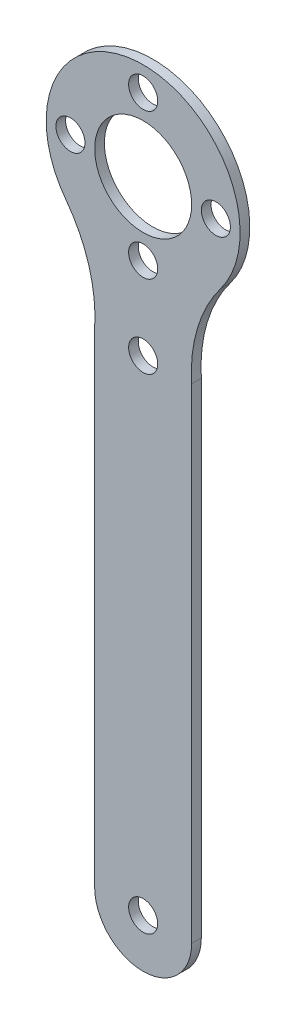
ISO-10303-21;
HEADER;
FILE_DESCRIPTION(('STEP AP214'),'2;1');
FILE_NAME('part.step','',(''),(''),'','','');
FILE_SCHEMA(('AUTOMOTIVE_DESIGN { 1 0 10303 214 1 1 1 1 }'));
ENDSEC;
DATA;
#1=APPLICATION_CONTEXT('core data for automotive mechanical design processes');
#2=APPLICATION_PROTOCOL_DEFINITION('international standard','automotive_design',2000,#1);
#3=PRODUCT_CONTEXT('',#1,'mechanical');
#4=PRODUCT('Part','Part','',(#3));
#5=PRODUCT_RELATED_PRODUCT_CATEGORY('part','',(#4));
#6=PRODUCT_DEFINITION_FORMATION('','',#4);
#7=PRODUCT_DEFINITION_CONTEXT('part definition',#1,'design');
#8=PRODUCT_DEFINITION('design','',#6,#7);
#9=PRODUCT_DEFINITION_SHAPE('','',#8);
#10=(LENGTH_UNIT() NAMED_UNIT(*) SI_UNIT(.MILLI.,.METRE.));
#11=(NAMED_UNIT(*) PLANE_ANGLE_UNIT() SI_UNIT($,.RADIAN.));
#12=(NAMED_UNIT(*) SI_UNIT($,.STERADIAN.) SOLID_ANGLE_UNIT());
#13=UNCERTAINTY_MEASURE_WITH_UNIT(LENGTH_MEASURE(1.E-05),#10,'distance_accuracy_value','');
#14=(GEOMETRIC_REPRESENTATION_CONTEXT(3) GLOBAL_UNCERTAINTY_ASSIGNED_CONTEXT((#13)) GLOBAL_UNIT_ASSIGNED_CONTEXT((#10,
#11,#12)) REPRESENTATION_CONTEXT('',''));
#15=CARTESIAN_POINT('',(0.,0.,0.));
#16=DIRECTION('',(0.,0.,1.));
#17=DIRECTION('',(1.,0.,0.));
#18=AXIS2_PLACEMENT_3D('',#15,#16,#17);
#19=CARTESIAN_POINT('',(0.,41.,1.));
#20=DIRECTION('',(0.,0.,-1.));
#21=DIRECTION('',(-1.,0.,0.));
#22=AXIS2_PLACEMENT_3D('',#19,#20,#21);
#23=CYLINDRICAL_SURFACE('',#22,10.);
#24=CARTESIAN_POINT('',(0.,41.,0.));
#25=DIRECTION('',(0.,0.,1.));
#26=DIRECTION('',(1.,0.,0.));
#27=AXIS2_PLACEMENT_3D('',#24,#25,#26);
#28=CIRCLE('',#27,10.);
#29=CARTESIAN_POINT('',(7.98772100593223,34.9836628143538,0.));
#30=VERTEX_POINT('',#29);
#31=CARTESIAN_POINT('',(-7.98772100593224,34.9836628143538,0.));
#32=VERTEX_POINT('',#31);
#33=EDGE_CURVE('E158',#30,#32,#28,.T.);
#34=ORIENTED_EDGE('',*,*,#33,.T.);
#35=DIRECTION('',(0.,0.,-1.));
#36=VECTOR('',#35,1.);
#37=CARTESIAN_POINT('',(-7.98772100593224,34.9836628143538,1.));
#38=LINE('',#37,#36);
#39=CARTESIAN_POINT('',(-7.98772100593224,34.9836628143538,1.));
#40=VERTEX_POINT('',#39);
#41=EDGE_CURVE('E11',#40,#32,#38,.T.);
#42=ORIENTED_EDGE('',*,*,#41,.F.);
#43=CARTESIAN_POINT('',(0.,41.,1.));
#44=DIRECTION('',(0.,0.,1.));
#45=DIRECTION('',(1.,0.,0.));
#46=AXIS2_PLACEMENT_3D('',#43,#44,#45);
#47=CIRCLE('',#46,10.);
#48=CARTESIAN_POINT('',(7.98772100593223,34.9836628143538,1.));
#49=VERTEX_POINT('',#48);
#50=EDGE_CURVE('E93',#49,#40,#47,.T.);
#51=ORIENTED_EDGE('',*,*,#50,.F.);
#52=DIRECTION('',(0.,0.,-1.));
#53=VECTOR('',#52,1.);
#54=CARTESIAN_POINT('',(7.98772100593223,34.9836628143538,1.));
#55=LINE('',#54,#53);
#56=EDGE_CURVE('E137',#49,#30,#55,.T.);
#57=ORIENTED_EDGE('',*,*,#56,.T.);
#58=EDGE_LOOP('',(#34,#42,#51,#57));
#59=FACE_BOUND('',#58,.T.);
#60=ADVANCED_FACE('F41',(#59),#23,.T.);
#61=CARTESIAN_POINT('',(-19.9693025148306,25.9591570358846,1.));
#62=DIRECTION('',(0.,0.,-1.));
#63=DIRECTION('',(-1.,0.,0.));
#64=AXIS2_PLACEMENT_3D('',#61,#62,#63);
#65=CYLINDRICAL_SURFACE('',#64,15.);
#66=CARTESIAN_POINT('',(-19.9693025148306,25.9591570358846,0.));
#67=DIRECTION('',(0.,0.,1.));
#68=DIRECTION('',(1.,0.,0.));
#69=AXIS2_PLACEMENT_3D('',#66,#67,#68);
#70=CIRCLE('',#69,15.);
#71=CARTESIAN_POINT('',(-5.00000000000001,25.,0.));
#72=VERTEX_POINT('',#71);
#73=EDGE_CURVE('E162',#72,#32,#70,.T.);
#74=ORIENTED_EDGE('',*,*,#73,.F.);
#75=DIRECTION('',(0.,0.,-1.));
#76=VECTOR('',#75,1.);
#77=CARTESIAN_POINT('',(-5.00000000000001,25.,1.));
#78=LINE('',#77,#76);
#79=CARTESIAN_POINT('',(-5.00000000000001,25.,1.));
#80=VERTEX_POINT('',#79);
#81=EDGE_CURVE('E51',#80,#72,#78,.T.);
#82=ORIENTED_EDGE('',*,*,#81,.F.);
#83=CARTESIAN_POINT('',(-19.9693025148306,25.9591570358846,1.));
#84=DIRECTION('',(0.,0.,1.));
#85=DIRECTION('',(1.,0.,0.));
#86=AXIS2_PLACEMENT_3D('',#83,#84,#85);
#87=CIRCLE('',#86,15.);
#88=EDGE_CURVE('E396',#80,#40,#87,.T.);
#89=ORIENTED_EDGE('',*,*,#88,.T.);
#90=ORIENTED_EDGE('',*,*,#41,.T.);
#91=EDGE_LOOP('',(#74,#82,#89,#90));
#92=FACE_BOUND('',#91,.T.);
#93=ADVANCED_FACE('F197',(#92),#65,.F.);
#94=CARTESIAN_POINT('',(-5.,0.,1.));
#95=DIRECTION('',(-1.,0.,0.));
#96=DIRECTION('',(0.,-1.,0.));
#97=AXIS2_PLACEMENT_3D('',#94,#95,#96);
#98=PLANE('',#97);
#99=DIRECTION('',(0.,1.,0.));
#100=VECTOR('',#99,1.);
#101=CARTESIAN_POINT('',(-5.,0.,0.));
#102=LINE('',#101,#100);
#103=CARTESIAN_POINT('',(-5.,-25.,0.));
#104=VERTEX_POINT('',#103);
#105=EDGE_CURVE('E166',#104,#72,#102,.T.);
#106=ORIENTED_EDGE('',*,*,#105,.F.);
#107=DIRECTION('',(0.,0.,-1.));
#108=VECTOR('',#107,1.);
#109=CARTESIAN_POINT('',(-5.,-25.,1.));
#110=LINE('',#109,#108);
#111=CARTESIAN_POINT('',(-5.,-25.,1.));
#112=VERTEX_POINT('',#111);
#113=EDGE_CURVE('E119',#112,#104,#110,.T.);
#114=ORIENTED_EDGE('',*,*,#113,.F.);
#115=DIRECTION('',(0.,1.,0.));
#116=VECTOR('',#115,1.);
#117=CARTESIAN_POINT('',(-5.,0.,1.));
#118=LINE('',#117,#116);
#119=EDGE_CURVE('E110',#112,#80,#118,.T.);
#120=ORIENTED_EDGE('',*,*,#119,.T.);
#121=ORIENTED_EDGE('',*,*,#81,.T.);
#122=EDGE_LOOP('',(#106,#114,#120,#121));
#123=FACE_BOUND('',#122,.T.);
#124=ADVANCED_FACE('F194',(#123),#98,.T.);
#125=CARTESIAN_POINT('',(0.,-25.,1.));
#126=DIRECTION('',(0.,0.,-1.));
#127=DIRECTION('',(-1.,0.,0.));
#128=AXIS2_PLACEMENT_3D('',#125,#126,#127);
#129=CYLINDRICAL_SURFACE('',#128,5.);
#130=CARTESIAN_POINT('',(0.,-25.,0.));
#131=DIRECTION('',(0.,0.,1.));
#132=DIRECTION('',(1.,0.,0.));
#133=AXIS2_PLACEMENT_3D('',#130,#131,#132);
#134=CIRCLE('',#133,5.);
#135=CARTESIAN_POINT('',(5.,-25.,0.));
#136=VERTEX_POINT('',#135);
#137=EDGE_CURVE('E117',#104,#136,#134,.T.);
#138=ORIENTED_EDGE('',*,*,#137,.T.);
#139=DIRECTION('',(0.,0.,-1.));
#140=VECTOR('',#139,1.);
#141=CARTESIAN_POINT('',(5.,-25.,1.));
#142=LINE('',#141,#140);
#143=CARTESIAN_POINT('',(5.,-25.,1.));
#144=VERTEX_POINT('',#143);
#145=EDGE_CURVE('E114',#144,#136,#142,.T.);
#146=ORIENTED_EDGE('',*,*,#145,.F.);
#147=CARTESIAN_POINT('',(0.,-25.,1.));
#148=DIRECTION('',(0.,0.,1.));
#149=DIRECTION('',(1.,0.,0.));
#150=AXIS2_PLACEMENT_3D('',#147,#148,#149);
#151=CIRCLE('',#150,5.);
#152=EDGE_CURVE('E103',#112,#144,#151,.T.);
#153=ORIENTED_EDGE('',*,*,#152,.F.);
#154=ORIENTED_EDGE('',*,*,#113,.T.);
#155=EDGE_LOOP('',(#138,#146,#153,#154));
#156=FACE_BOUND('',#155,.T.);
#157=ADVANCED_FACE('F115',(#156),#129,.T.);
#158=CARTESIAN_POINT('',(4.99999999999999,0.,1.));
#159=DIRECTION('',(-1.,0.,0.));
#160=DIRECTION('',(0.,-1.,0.));
#161=AXIS2_PLACEMENT_3D('',#158,#159,#160);
#162=PLANE('',#161);
#163=DIRECTION('',(0.,1.,0.));
#164=VECTOR('',#163,1.);
#165=CARTESIAN_POINT('',(4.99999999999999,0.,0.));
#166=LINE('',#165,#164);
#167=CARTESIAN_POINT('',(4.99999999999999,25.,0.));
#168=VERTEX_POINT('',#167);
#169=EDGE_CURVE('E81',#136,#168,#166,.T.);
#170=ORIENTED_EDGE('',*,*,#169,.T.);
#171=DIRECTION('',(0.,0.,-1.));
#172=VECTOR('',#171,1.);
#173=CARTESIAN_POINT('',(4.99999999999999,25.,1.));
#174=LINE('',#173,#172);
#175=CARTESIAN_POINT('',(4.99999999999999,25.,1.));
#176=VERTEX_POINT('',#175);
#177=EDGE_CURVE('E120',#176,#168,#174,.T.);
#178=ORIENTED_EDGE('',*,*,#177,.F.);
#179=DIRECTION('',(0.,1.,0.));
#180=VECTOR('',#179,1.);
#181=CARTESIAN_POINT('',(4.99999999999999,0.,1.));
#182=LINE('',#181,#180);
#183=EDGE_CURVE('E108',#144,#176,#182,.T.);
#184=ORIENTED_EDGE('',*,*,#183,.F.);
#185=ORIENTED_EDGE('',*,*,#145,.T.);
#186=EDGE_LOOP('',(#170,#178,#184,#185));
#187=FACE_BOUND('',#186,.T.);
#188=ADVANCED_FACE('F122',(#187),#162,.F.);
#189=CARTESIAN_POINT('',(0.,-25.,1.));
#190=DIRECTION('',(0.,0.,-1.));
#191=DIRECTION('',(-1.,0.,0.));
#192=AXIS2_PLACEMENT_3D('',#189,#190,#191);
#193=CYLINDRICAL_SURFACE('',#192,1.5);
#194=CARTESIAN_POINT('',(0.,-25.,1.));
#195=DIRECTION('',(0.,0.,1.));
#196=DIRECTION('',(1.,0.,0.));
#197=AXIS2_PLACEMENT_3D('',#194,#195,#196);
#198=CIRCLE('',#197,1.5);
#199=CARTESIAN_POINT('',(1.50000000000001,-25.,1.));
#200=VERTEX_POINT('',#199);
#201=EDGE_CURVE('E126',#200,#200,#198,.T.);
#202=ORIENTED_EDGE('',*,*,#201,.T.);
#203=EDGE_LOOP('',(#202));
#204=FACE_BOUND('',#203,.T.);
#205=CARTESIAN_POINT('',(0.,-25.,0.));
#206=DIRECTION('',(0.,0.,1.));
#207=DIRECTION('',(1.,0.,0.));
#208=AXIS2_PLACEMENT_3D('',#205,#206,#207);
#209=CIRCLE('',#208,1.5);
#210=CARTESIAN_POINT('',(1.50000000000001,-25.,0.));
#211=VERTEX_POINT('',#210);
#212=EDGE_CURVE('E176',#211,#211,#209,.T.);
#213=ORIENTED_EDGE('',*,*,#212,.F.);
#214=EDGE_LOOP('',(#213));
#215=FACE_BOUND('',#214,.T.);
#216=ADVANCED_FACE('F206',(#204,#215),#193,.F.);
#217=CARTESIAN_POINT('',(19.9693025148306,25.9591570358845,1.));
#218=DIRECTION('',(0.,0.,-1.));
#219=DIRECTION('',(-1.,0.,0.));
#220=AXIS2_PLACEMENT_3D('',#217,#218,#219);
#221=CYLINDRICAL_SURFACE('',#220,15.);
#222=CARTESIAN_POINT('',(19.9693025148306,25.9591570358845,0.));
#223=DIRECTION('',(0.,0.,1.));
#224=DIRECTION('',(1.,0.,0.));
#225=AXIS2_PLACEMENT_3D('',#222,#223,#224);
#226=CIRCLE('',#225,15.);
#227=EDGE_CURVE('E87',#168,#30,#226,.F.);
#228=ORIENTED_EDGE('',*,*,#227,.T.);
#229=ORIENTED_EDGE('',*,*,#56,.F.);
#230=CARTESIAN_POINT('',(19.9693025148306,25.9591570358845,1.));
#231=DIRECTION('',(0.,0.,1.));
#232=DIRECTION('',(1.,0.,0.));
#233=AXIS2_PLACEMENT_3D('',#230,#231,#232);
#234=CIRCLE('',#233,15.);
#235=EDGE_CURVE('E59',#176,#49,#234,.F.);
#236=ORIENTED_EDGE('',*,*,#235,.F.);
#237=ORIENTED_EDGE('',*,*,#177,.T.);
#238=EDGE_LOOP('',(#228,#229,#236,#237));
#239=FACE_BOUND('',#238,.T.);
#240=ADVANCED_FACE('F203',(#239),#221,.F.);
#241=CARTESIAN_POINT('',(0.,41.,1.));
#242=DIRECTION('',(0.,0.,-1.));
#243=DIRECTION('',(-1.,0.,0.));
#244=AXIS2_PLACEMENT_3D('',#241,#242,#243);
#245=CYLINDRICAL_SURFACE('',#244,5.);
#246=CARTESIAN_POINT('',(0.,41.,1.));
#247=DIRECTION('',(0.,0.,1.));
#248=DIRECTION('',(1.,0.,0.));
#249=AXIS2_PLACEMENT_3D('',#246,#247,#248);
#250=CIRCLE('',#249,5.);
#251=CARTESIAN_POINT('',(5.,41.,1.));
#252=VERTEX_POINT('',#251);
#253=EDGE_CURVE('E391',#252,#252,#250,.T.);
#254=ORIENTED_EDGE('',*,*,#253,.T.);
#255=EDGE_LOOP('',(#254));
#256=FACE_BOUND('',#255,.T.);
#257=CARTESIAN_POINT('',(0.,41.,0.));
#258=DIRECTION('',(0.,0.,1.));
#259=DIRECTION('',(1.,0.,0.));
#260=AXIS2_PLACEMENT_3D('',#257,#258,#259);
#261=CIRCLE('',#260,5.);
#262=CARTESIAN_POINT('',(5.,41.,0.));
#263=VERTEX_POINT('',#262);
#264=EDGE_CURVE('E154',#263,#263,#261,.T.);
#265=ORIENTED_EDGE('',*,*,#264,.F.);
#266=EDGE_LOOP('',(#265));
#267=FACE_BOUND('',#266,.T.);
#268=ADVANCED_FACE('F205',(#256,#267),#245,.F.);
#269=CARTESIAN_POINT('',(0.,48.5,1.));
#270=DIRECTION('',(0.,0.,-1.));
#271=DIRECTION('',(-1.,0.,0.));
#272=AXIS2_PLACEMENT_3D('',#269,#270,#271);
#273=CYLINDRICAL_SURFACE('',#272,1.5);
#274=CARTESIAN_POINT('',(0.,48.5,1.));
#275=DIRECTION('',(0.,0.,1.));
#276=DIRECTION('',(1.,0.,0.));
#277=AXIS2_PLACEMENT_3D('',#274,#275,#276);
#278=CIRCLE('',#277,1.5);
#279=CARTESIAN_POINT('',(1.5,48.5,1.));
#280=VERTEX_POINT('',#279);
#281=EDGE_CURVE('E388',#280,#280,#278,.T.);
#282=ORIENTED_EDGE('',*,*,#281,.T.);
#283=EDGE_LOOP('',(#282));
#284=FACE_BOUND('',#283,.T.);
#285=CARTESIAN_POINT('',(0.,48.5,0.));
#286=DIRECTION('',(0.,0.,1.));
#287=DIRECTION('',(1.,0.,0.));
#288=AXIS2_PLACEMENT_3D('',#285,#286,#287);
#289=CIRCLE('',#288,1.5);
#290=CARTESIAN_POINT('',(1.5,48.5,0.));
#291=VERTEX_POINT('',#290);
#292=EDGE_CURVE('E150',#291,#291,#289,.T.);
#293=ORIENTED_EDGE('',*,*,#292,.F.);
#294=EDGE_LOOP('',(#293));
#295=FACE_BOUND('',#294,.T.);
#296=ADVANCED_FACE('F212',(#284,#295),#273,.F.);
#297=CARTESIAN_POINT('',(7.5,41.,1.));
#298=DIRECTION('',(0.,0.,-1.));
#299=DIRECTION('',(-1.,0.,0.));
#300=AXIS2_PLACEMENT_3D('',#297,#298,#299);
#301=CYLINDRICAL_SURFACE('',#300,1.5);
#302=CARTESIAN_POINT('',(7.5,41.,1.));
#303=DIRECTION('',(0.,0.,1.));
#304=DIRECTION('',(1.,0.,0.));
#305=AXIS2_PLACEMENT_3D('',#302,#303,#304);
#306=CIRCLE('',#305,1.5);
#307=CARTESIAN_POINT('',(9.,41.,1.));
#308=VERTEX_POINT('',#307);
#309=EDGE_CURVE('E384',#308,#308,#306,.T.);
#310=ORIENTED_EDGE('',*,*,#309,.T.);
#311=EDGE_LOOP('',(#310));
#312=FACE_BOUND('',#311,.T.);
#313=CARTESIAN_POINT('',(7.5,41.,0.));
#314=DIRECTION('',(0.,0.,1.));
#315=DIRECTION('',(1.,0.,0.));
#316=AXIS2_PLACEMENT_3D('',#313,#314,#315);
#317=CIRCLE('',#316,1.5);
#318=CARTESIAN_POINT('',(9.,41.,0.));
#319=VERTEX_POINT('',#318);
#320=EDGE_CURVE('E146',#319,#319,#317,.T.);
#321=ORIENTED_EDGE('',*,*,#320,.F.);
#322=EDGE_LOOP('',(#321));
#323=FACE_BOUND('',#322,.T.);
#324=ADVANCED_FACE('F228',(#312,#323),#301,.F.);
#325=CARTESIAN_POINT('',(0.,33.5,1.));
#326=DIRECTION('',(0.,0.,-1.));
#327=DIRECTION('',(-1.,0.,0.));
#328=AXIS2_PLACEMENT_3D('',#325,#326,#327);
#329=CYLINDRICAL_SURFACE('',#328,1.5);
#330=CARTESIAN_POINT('',(0.,33.5,1.));
#331=DIRECTION('',(0.,0.,1.));
#332=DIRECTION('',(1.,0.,0.));
#333=AXIS2_PLACEMENT_3D('',#330,#331,#332);
#334=CIRCLE('',#333,1.5);
#335=CARTESIAN_POINT('',(1.5,33.5,1.));
#336=VERTEX_POINT('',#335);
#337=EDGE_CURVE('E243',#336,#336,#334,.T.);
#338=ORIENTED_EDGE('',*,*,#337,.T.);
#339=EDGE_LOOP('',(#338));
#340=FACE_BOUND('',#339,.T.);
#341=CARTESIAN_POINT('',(0.,33.5,0.));
#342=DIRECTION('',(0.,0.,1.));
#343=DIRECTION('',(1.,0.,0.));
#344=AXIS2_PLACEMENT_3D('',#341,#342,#343);
#345=CIRCLE('',#344,1.5);
#346=CARTESIAN_POINT('',(1.5,33.5,0.));
#347=VERTEX_POINT('',#346);
#348=EDGE_CURVE('E142',#347,#347,#345,.T.);
#349=ORIENTED_EDGE('',*,*,#348,.F.);
#350=EDGE_LOOP('',(#349));
#351=FACE_BOUND('',#350,.T.);
#352=ADVANCED_FACE('F231',(#340,#351),#329,.F.);
#353=CARTESIAN_POINT('',(-7.5,41.,1.));
#354=DIRECTION('',(0.,0.,-1.));
#355=DIRECTION('',(-1.,0.,0.));
#356=AXIS2_PLACEMENT_3D('',#353,#354,#355);
#357=CYLINDRICAL_SURFACE('',#356,1.50000000000001);
#358=CARTESIAN_POINT('',(-7.5,41.,1.));
#359=DIRECTION('',(0.,0.,1.));
#360=DIRECTION('',(1.,0.,0.));
#361=AXIS2_PLACEMENT_3D('',#358,#359,#360);
#362=CIRCLE('',#361,1.50000000000001);
#363=CARTESIAN_POINT('',(-5.99999999999999,41.,1.));
#364=VERTEX_POINT('',#363);
#365=EDGE_CURVE('E184',#364,#364,#362,.T.);
#366=ORIENTED_EDGE('',*,*,#365,.T.);
#367=EDGE_LOOP('',(#366));
#368=FACE_BOUND('',#367,.T.);
#369=CARTESIAN_POINT('',(-7.5,41.,0.));
#370=DIRECTION('',(0.,0.,1.));
#371=DIRECTION('',(1.,0.,0.));
#372=AXIS2_PLACEMENT_3D('',#369,#370,#371);
#373=CIRCLE('',#372,1.50000000000001);
#374=CARTESIAN_POINT('',(-5.99999999999999,41.,0.));
#375=VERTEX_POINT('',#374);
#376=EDGE_CURVE('E138',#375,#375,#373,.T.);
#377=ORIENTED_EDGE('',*,*,#376,.F.);
#378=EDGE_LOOP('',(#377));
#379=FACE_BOUND('',#378,.T.);
#380=ADVANCED_FACE('F43',(#368,#379),#357,.F.);
#381=CARTESIAN_POINT('',(0.,25.,1.));
#382=DIRECTION('',(0.,0.,-1.));
#383=DIRECTION('',(-1.,0.,0.));
#384=AXIS2_PLACEMENT_3D('',#381,#382,#383);
#385=CYLINDRICAL_SURFACE('',#384,1.5);
#386=CARTESIAN_POINT('',(0.,25.,1.));
#387=DIRECTION('',(0.,0.,1.));
#388=DIRECTION('',(1.,0.,0.));
#389=AXIS2_PLACEMENT_3D('',#386,#387,#388);
#390=CIRCLE('',#389,1.5);
#391=CARTESIAN_POINT('',(1.5,25.,1.));
#392=VERTEX_POINT('',#391);
#393=EDGE_CURVE('E133',#392,#392,#390,.T.);
#394=ORIENTED_EDGE('',*,*,#393,.T.);
#395=EDGE_LOOP('',(#394));
#396=FACE_BOUND('',#395,.T.);
#397=CARTESIAN_POINT('',(0.,25.,0.));
#398=DIRECTION('',(0.,0.,1.));
#399=DIRECTION('',(1.,0.,0.));
#400=AXIS2_PLACEMENT_3D('',#397,#398,#399);
#401=CIRCLE('',#400,1.5);
#402=CARTESIAN_POINT('',(1.5,25.,0.));
#403=VERTEX_POINT('',#402);
#404=EDGE_CURVE('E180',#403,#403,#401,.T.);
#405=ORIENTED_EDGE('',*,*,#404,.F.);
#406=EDGE_LOOP('',(#405));
#407=FACE_BOUND('',#406,.T.);
#408=ADVANCED_FACE('F238',(#396,#407),#385,.F.);
#409=CARTESIAN_POINT('',(0.,0.,1.));
#410=DIRECTION('',(0.,0.,1.));
#411=DIRECTION('',(1.,0.,0.));
#412=AXIS2_PLACEMENT_3D('',#409,#410,#411);
#413=PLANE('',#412);
#414=ORIENTED_EDGE('',*,*,#365,.F.);
#415=EDGE_LOOP('',(#414));
#416=FACE_BOUND('',#415,.T.);
#417=ORIENTED_EDGE('',*,*,#337,.F.);
#418=EDGE_LOOP('',(#417));
#419=FACE_BOUND('',#418,.T.);
#420=ORIENTED_EDGE('',*,*,#309,.F.);
#421=EDGE_LOOP('',(#420));
#422=FACE_BOUND('',#421,.T.);
#423=ORIENTED_EDGE('',*,*,#281,.F.);
#424=EDGE_LOOP('',(#423));
#425=FACE_BOUND('',#424,.T.);
#426=ORIENTED_EDGE('',*,*,#253,.F.);
#427=EDGE_LOOP('',(#426));
#428=FACE_BOUND('',#427,.T.);
#429=ORIENTED_EDGE('',*,*,#50,.T.);
#430=ORIENTED_EDGE('',*,*,#88,.F.);
#431=ORIENTED_EDGE('',*,*,#119,.F.);
#432=ORIENTED_EDGE('',*,*,#152,.T.);
#433=ORIENTED_EDGE('',*,*,#183,.T.);
#434=ORIENTED_EDGE('',*,*,#235,.T.);
#435=EDGE_LOOP('',(#429,#430,#431,#432,#433,#434));
#436=FACE_BOUND('',#435,.T.);
#437=ORIENTED_EDGE('',*,*,#201,.F.);
#438=EDGE_LOOP('',(#437));
#439=FACE_BOUND('',#438,.T.);
#440=ORIENTED_EDGE('',*,*,#393,.F.);
#441=EDGE_LOOP('',(#440));
#442=FACE_BOUND('',#441,.T.);
#443=ADVANCED_FACE('F105',(#416,#419,#422,#425,#428,#436,#439,#442),#413,.T.);
#444=CARTESIAN_POINT('',(0.,0.,0.));
#445=DIRECTION('',(0.,0.,1.));
#446=DIRECTION('',(1.,0.,0.));
#447=AXIS2_PLACEMENT_3D('',#444,#445,#446);
#448=PLANE('',#447);
#449=ORIENTED_EDGE('',*,*,#376,.T.);
#450=EDGE_LOOP('',(#449));
#451=FACE_BOUND('',#450,.T.);
#452=ORIENTED_EDGE('',*,*,#348,.T.);
#453=EDGE_LOOP('',(#452));
#454=FACE_BOUND('',#453,.T.);
#455=ORIENTED_EDGE('',*,*,#320,.T.);
#456=EDGE_LOOP('',(#455));
#457=FACE_BOUND('',#456,.T.);
#458=ORIENTED_EDGE('',*,*,#292,.T.);
#459=EDGE_LOOP('',(#458));
#460=FACE_BOUND('',#459,.T.);
#461=ORIENTED_EDGE('',*,*,#264,.T.);
#462=EDGE_LOOP('',(#461));
#463=FACE_BOUND('',#462,.T.);
#464=ORIENTED_EDGE('',*,*,#33,.F.);
#465=ORIENTED_EDGE('',*,*,#227,.F.);
#466=ORIENTED_EDGE('',*,*,#169,.F.);
#467=ORIENTED_EDGE('',*,*,#137,.F.);
#468=ORIENTED_EDGE('',*,*,#105,.T.);
#469=ORIENTED_EDGE('',*,*,#73,.T.);
#470=EDGE_LOOP('',(#464,#465,#466,#467,#468,#469));
#471=FACE_BOUND('',#470,.T.);
#472=ORIENTED_EDGE('',*,*,#212,.T.);
#473=EDGE_LOOP('',(#472));
#474=FACE_BOUND('',#473,.T.);
#475=ORIENTED_EDGE('',*,*,#404,.T.);
#476=EDGE_LOOP('',(#475));
#477=FACE_BOUND('',#476,.T.);
#478=ADVANCED_FACE('F200',(#451,#454,#457,#460,#463,#471,#474,#477),#448,.F.);
#479=CLOSED_SHELL('',(#60,#93,#124,#157,#188,#216,#240,#268,#296,#324,#352,#380,#408,#443,#478));
#480=MANIFOLD_SOLID_BREP('B2',#479);
#481=ADVANCED_BREP_SHAPE_REPRESENTATION('',(#18,#480),#14);
#482=SHAPE_DEFINITION_REPRESENTATION(#9,#481);
ENDSEC;
END-ISO-10303-21;
